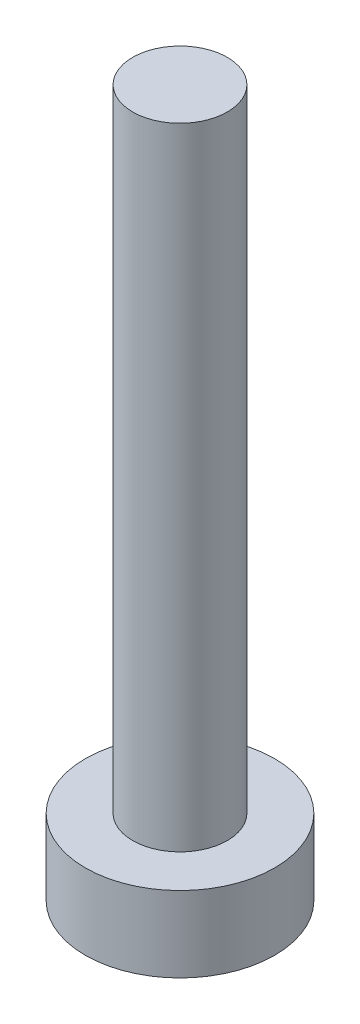
ISO-10303-21;
HEADER;
FILE_DESCRIPTION(('STEP AP214'),'2;1');
FILE_NAME('part.step','',(''),(''),'','','');
FILE_SCHEMA(('AUTOMOTIVE_DESIGN { 1 0 10303 214 1 1 1 1 }'));
ENDSEC;
DATA;
#1=APPLICATION_CONTEXT('core data for automotive mechanical design processes');
#2=APPLICATION_PROTOCOL_DEFINITION('international standard','automotive_design',2000,#1);
#3=PRODUCT_CONTEXT('',#1,'mechanical');
#4=PRODUCT('Part','Part','',(#3));
#5=PRODUCT_RELATED_PRODUCT_CATEGORY('part','',(#4));
#6=PRODUCT_DEFINITION_FORMATION('','',#4);
#7=PRODUCT_DEFINITION_CONTEXT('part definition',#1,'design');
#8=PRODUCT_DEFINITION('design','',#6,#7);
#9=PRODUCT_DEFINITION_SHAPE('','',#8);
#10=(LENGTH_UNIT() NAMED_UNIT(*) SI_UNIT(.MILLI.,.METRE.));
#11=(NAMED_UNIT(*) PLANE_ANGLE_UNIT() SI_UNIT($,.RADIAN.));
#12=(NAMED_UNIT(*) SI_UNIT($,.STERADIAN.) SOLID_ANGLE_UNIT());
#13=UNCERTAINTY_MEASURE_WITH_UNIT(LENGTH_MEASURE(1.E-05),#10,'distance_accuracy_value','');
#14=(GEOMETRIC_REPRESENTATION_CONTEXT(3) GLOBAL_UNCERTAINTY_ASSIGNED_CONTEXT((#13)) GLOBAL_UNIT_ASSIGNED_CONTEXT((#10,
#11,#12)) REPRESENTATION_CONTEXT('',''));
#15=CARTESIAN_POINT('',(0.,0.,0.));
#16=DIRECTION('',(0.,0.,1.));
#17=DIRECTION('',(1.,0.,0.));
#18=AXIS2_PLACEMENT_3D('',#15,#16,#17);
#19=CARTESIAN_POINT('',(0.,2.4,0.));
#20=DIRECTION('',(0.,-1.,0.));
#21=DIRECTION('',(0.,0.,-1.));
#22=AXIS2_PLACEMENT_3D('',#19,#20,#21);
#23=CYLINDRICAL_SURFACE('',#22,3.);
#24=CARTESIAN_POINT('',(0.,2.4,0.));
#25=DIRECTION('',(0.,1.,0.));
#26=DIRECTION('',(0.,0.,1.));
#27=AXIS2_PLACEMENT_3D('',#24,#25,#26);
#28=CIRCLE('',#27,3.);
#29=CARTESIAN_POINT('',(0.,2.4,3.));
#30=VERTEX_POINT('',#29);
#31=EDGE_CURVE('E38',#30,#30,#28,.T.);
#32=ORIENTED_EDGE('',*,*,#31,.F.);
#33=EDGE_LOOP('',(#32));
#34=FACE_BOUND('',#33,.T.);
#35=CARTESIAN_POINT('',(0.,0.,0.));
#36=DIRECTION('',(0.,1.,0.));
#37=DIRECTION('',(0.,0.,1.));
#38=AXIS2_PLACEMENT_3D('',#35,#36,#37);
#39=CIRCLE('',#38,3.);
#40=CARTESIAN_POINT('',(0.,0.,3.));
#41=VERTEX_POINT('',#40);
#42=EDGE_CURVE('E34',#41,#41,#39,.T.);
#43=ORIENTED_EDGE('',*,*,#42,.T.);
#44=EDGE_LOOP('',(#43));
#45=FACE_BOUND('',#44,.T.);
#46=ADVANCED_FACE('F31',(#34,#45),#23,.T.);
#47=CARTESIAN_POINT('',(0.,2.4,0.));
#48=DIRECTION('',(0.,1.,0.));
#49=DIRECTION('',(0.,0.,1.));
#50=AXIS2_PLACEMENT_3D('',#47,#48,#49);
#51=PLANE('',#50);
#52=CARTESIAN_POINT('',(0.,2.4,0.));
#53=DIRECTION('',(0.,1.,0.));
#54=DIRECTION('',(0.,0.,1.));
#55=AXIS2_PLACEMENT_3D('',#52,#53,#54);
#56=CIRCLE('',#55,1.5);
#57=CARTESIAN_POINT('',(0.,2.4,1.5));
#58=VERTEX_POINT('',#57);
#59=EDGE_CURVE('E10',#58,#58,#56,.T.);
#60=ORIENTED_EDGE('',*,*,#59,.F.);
#61=EDGE_LOOP('',(#60));
#62=FACE_BOUND('',#61,.T.);
#63=ORIENTED_EDGE('',*,*,#31,.T.);
#64=EDGE_LOOP('',(#63));
#65=FACE_BOUND('',#64,.T.);
#66=ADVANCED_FACE('F55',(#62,#65),#51,.T.);
#67=CARTESIAN_POINT('',(0.,0.,0.));
#68=DIRECTION('',(0.,1.,0.));
#69=DIRECTION('',(0.,0.,1.));
#70=AXIS2_PLACEMENT_3D('',#67,#68,#69);
#71=PLANE('',#70);
#72=ORIENTED_EDGE('',*,*,#42,.F.);
#73=EDGE_LOOP('',(#72));
#74=FACE_BOUND('',#73,.T.);
#75=ADVANCED_FACE('F52',(#74),#71,.F.);
#76=CARTESIAN_POINT('',(0.,22.4,0.));
#77=DIRECTION('',(0.,-1.,0.));
#78=DIRECTION('',(0.,0.,-1.));
#79=AXIS2_PLACEMENT_3D('',#76,#77,#78);
#80=CYLINDRICAL_SURFACE('',#79,1.5);
#81=CARTESIAN_POINT('',(0.,22.4,0.));
#82=DIRECTION('',(0.,1.,0.));
#83=DIRECTION('',(0.,0.,1.));
#84=AXIS2_PLACEMENT_3D('',#81,#82,#83);
#85=CIRCLE('',#84,1.5);
#86=CARTESIAN_POINT('',(0.,22.4,1.5));
#87=VERTEX_POINT('',#86);
#88=EDGE_CURVE('E44',#87,#87,#85,.T.);
#89=ORIENTED_EDGE('',*,*,#88,.F.);
#90=EDGE_LOOP('',(#89));
#91=FACE_BOUND('',#90,.T.);
#92=ORIENTED_EDGE('',*,*,#59,.T.);
#93=EDGE_LOOP('',(#92));
#94=FACE_BOUND('',#93,.T.);
#95=ADVANCED_FACE('F54',(#91,#94),#80,.T.);
#96=CARTESIAN_POINT('',(0.,22.4,0.));
#97=DIRECTION('',(0.,1.,0.));
#98=DIRECTION('',(0.,0.,1.));
#99=AXIS2_PLACEMENT_3D('',#96,#97,#98);
#100=PLANE('',#99);
#101=ORIENTED_EDGE('',*,*,#88,.T.);
#102=EDGE_LOOP('',(#101));
#103=FACE_BOUND('',#102,.T.);
#104=ADVANCED_FACE('F60',(#103),#100,.T.);
#105=CLOSED_SHELL('',(#46,#66,#75,#95,#104));
#106=MANIFOLD_SOLID_BREP('B2',#105);
#107=ADVANCED_BREP_SHAPE_REPRESENTATION('',(#18,#106),#14);
#108=SHAPE_DEFINITION_REPRESENTATION(#9,#107);
ENDSEC;
END-ISO-10303-21;
